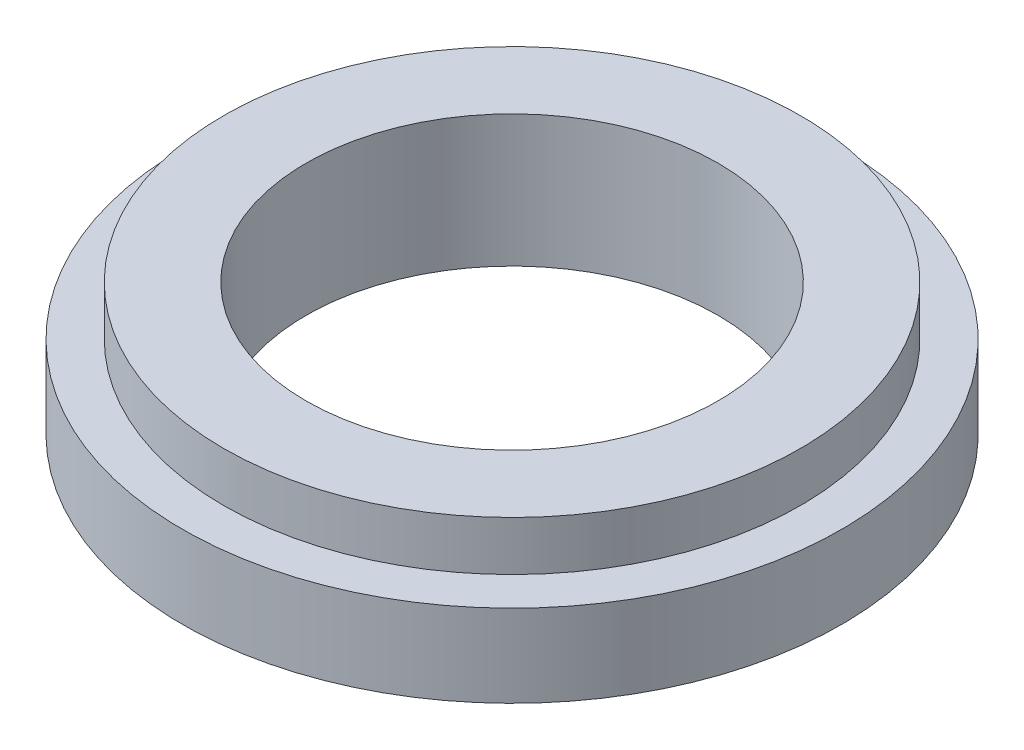
ISO-10303-21;
HEADER;
FILE_DESCRIPTION(('STEP AP214'),'2;1');
FILE_NAME('part.step','',(''),(''),'','','');
FILE_SCHEMA(('AUTOMOTIVE_DESIGN { 1 0 10303 214 1 1 1 1 }'));
ENDSEC;
DATA;
#1=APPLICATION_CONTEXT('core data for automotive mechanical design processes');
#2=APPLICATION_PROTOCOL_DEFINITION('international standard','automotive_design',2000,#1);
#3=PRODUCT_CONTEXT('',#1,'mechanical');
#4=PRODUCT('Part','Part','',(#3));
#5=PRODUCT_RELATED_PRODUCT_CATEGORY('part','',(#4));
#6=PRODUCT_DEFINITION_FORMATION('','',#4);
#7=PRODUCT_DEFINITION_CONTEXT('part definition',#1,'design');
#8=PRODUCT_DEFINITION('design','',#6,#7);
#9=PRODUCT_DEFINITION_SHAPE('','',#8);
#10=(LENGTH_UNIT() NAMED_UNIT(*) SI_UNIT(.MILLI.,.METRE.));
#11=(NAMED_UNIT(*) PLANE_ANGLE_UNIT() SI_UNIT($,.RADIAN.));
#12=(NAMED_UNIT(*) SI_UNIT($,.STERADIAN.) SOLID_ANGLE_UNIT());
#13=UNCERTAINTY_MEASURE_WITH_UNIT(LENGTH_MEASURE(1.E-05),#10,'distance_accuracy_value','');
#14=(GEOMETRIC_REPRESENTATION_CONTEXT(3) GLOBAL_UNCERTAINTY_ASSIGNED_CONTEXT((#13)) GLOBAL_UNIT_ASSIGNED_CONTEXT((#10,
#11,#12)) REPRESENTATION_CONTEXT('',''));
#15=CARTESIAN_POINT('',(0.,0.,0.));
#16=DIRECTION('',(0.,0.,1.));
#17=DIRECTION('',(1.,0.,0.));
#18=AXIS2_PLACEMENT_3D('',#15,#16,#17);
#19=CARTESIAN_POINT('',(0.,3.,0.));
#20=DIRECTION('',(0.,1.,0.));
#21=DIRECTION('',(0.,0.,1.));
#22=AXIS2_PLACEMENT_3D('',#19,#20,#21);
#23=PLANE('',#22);
#24=CARTESIAN_POINT('',(0.,3.,0.));
#25=DIRECTION('',(0.,1.,0.));
#26=DIRECTION('',(0.,0.,1.));
#27=AXIS2_PLACEMENT_3D('',#24,#25,#26);
#28=CIRCLE('',#27,17.5);
#29=CARTESIAN_POINT('',(0.,3.,17.5));
#30=VERTEX_POINT('',#29);
#31=EDGE_CURVE('E11',#30,#30,#28,.T.);
#32=ORIENTED_EDGE('',*,*,#31,.T.);
#33=EDGE_LOOP('',(#32));
#34=FACE_BOUND('',#33,.T.);
#35=CARTESIAN_POINT('',(0.,3.,0.));
#36=DIRECTION('',(0.,1.,0.));
#37=DIRECTION('',(0.,0.,1.));
#38=AXIS2_PLACEMENT_3D('',#35,#36,#37);
#39=CIRCLE('',#38,12.5);
#40=CARTESIAN_POINT('',(0.,3.,12.5));
#41=VERTEX_POINT('',#40);
#42=EDGE_CURVE('E45',#41,#41,#39,.T.);
#43=ORIENTED_EDGE('',*,*,#42,.F.);
#44=EDGE_LOOP('',(#43));
#45=FACE_BOUND('',#44,.T.);
#46=ADVANCED_FACE('F37',(#34,#45),#23,.T.);
#47=CARTESIAN_POINT('',(0.,3.,0.));
#48=DIRECTION('',(0.,-1.,0.));
#49=DIRECTION('',(0.,0.,-1.));
#50=AXIS2_PLACEMENT_3D('',#47,#48,#49);
#51=CYLINDRICAL_SURFACE('',#50,17.5);
#52=ORIENTED_EDGE('',*,*,#31,.F.);
#53=EDGE_LOOP('',(#52));
#54=FACE_BOUND('',#53,.T.);
#55=CARTESIAN_POINT('',(0.,0.,0.));
#56=DIRECTION('',(0.,1.,0.));
#57=DIRECTION('',(0.,0.,1.));
#58=AXIS2_PLACEMENT_3D('',#55,#56,#57);
#59=CIRCLE('',#58,17.5);
#60=CARTESIAN_POINT('',(0.,0.,17.5));
#61=VERTEX_POINT('',#60);
#62=EDGE_CURVE('E41',#61,#61,#59,.T.);
#63=ORIENTED_EDGE('',*,*,#62,.T.);
#64=EDGE_LOOP('',(#63));
#65=FACE_BOUND('',#64,.T.);
#66=ADVANCED_FACE('F39',(#54,#65),#51,.T.);
#67=CARTESIAN_POINT('',(0.,3.,0.));
#68=DIRECTION('',(0.,-1.,0.));
#69=DIRECTION('',(0.,0.,-1.));
#70=AXIS2_PLACEMENT_3D('',#67,#68,#69);
#71=CYLINDRICAL_SURFACE('',#70,12.5);
#72=ORIENTED_EDGE('',*,*,#42,.T.);
#73=EDGE_LOOP('',(#72));
#74=FACE_BOUND('',#73,.T.);
#75=CARTESIAN_POINT('',(0.,-5.,0.));
#76=DIRECTION('',(0.,-1.,0.));
#77=DIRECTION('',(0.,0.,-1.));
#78=AXIS2_PLACEMENT_3D('',#75,#76,#77);
#79=CIRCLE('',#78,12.5);
#80=CARTESIAN_POINT('',(0.,-5.,-12.5));
#81=VERTEX_POINT('',#80);
#82=EDGE_CURVE('E55',#81,#81,#79,.T.);
#83=ORIENTED_EDGE('',*,*,#82,.T.);
#84=EDGE_LOOP('',(#83));
#85=FACE_BOUND('',#84,.T.);
#86=ADVANCED_FACE('F61',(#74,#85),#71,.F.);
#87=CARTESIAN_POINT('',(0.,-5.,0.));
#88=DIRECTION('',(0.,-1.,0.));
#89=DIRECTION('',(0.,0.,-1.));
#90=AXIS2_PLACEMENT_3D('',#87,#88,#89);
#91=PLANE('',#90);
#92=CARTESIAN_POINT('',(0.,-5.,0.));
#93=DIRECTION('',(0.,-1.,0.));
#94=DIRECTION('',(0.,0.,-1.));
#95=AXIS2_PLACEMENT_3D('',#92,#93,#94);
#96=CIRCLE('',#95,20.);
#97=CARTESIAN_POINT('',(0.,-5.,-20.));
#98=VERTEX_POINT('',#97);
#99=EDGE_CURVE('E54',#98,#98,#96,.T.);
#100=ORIENTED_EDGE('',*,*,#99,.T.);
#101=EDGE_LOOP('',(#100));
#102=FACE_BOUND('',#101,.T.);
#103=ORIENTED_EDGE('',*,*,#82,.F.);
#104=EDGE_LOOP('',(#103));
#105=FACE_BOUND('',#104,.T.);
#106=ADVANCED_FACE('F63',(#102,#105),#91,.T.);
#107=CARTESIAN_POINT('',(0.,0.,0.));
#108=DIRECTION('',(0.,-1.,0.));
#109=DIRECTION('',(0.,0.,-1.));
#110=AXIS2_PLACEMENT_3D('',#107,#108,#109);
#111=PLANE('',#110);
#112=ORIENTED_EDGE('',*,*,#62,.F.);
#113=EDGE_LOOP('',(#112));
#114=FACE_BOUND('',#113,.T.);
#115=CARTESIAN_POINT('',(0.,0.,0.));
#116=DIRECTION('',(0.,-1.,0.));
#117=DIRECTION('',(0.,0.,-1.));
#118=AXIS2_PLACEMENT_3D('',#115,#116,#117);
#119=CIRCLE('',#118,20.);
#120=CARTESIAN_POINT('',(0.,0.,-20.));
#121=VERTEX_POINT('',#120);
#122=EDGE_CURVE('E51',#121,#121,#119,.T.);
#123=ORIENTED_EDGE('',*,*,#122,.F.);
#124=EDGE_LOOP('',(#123));
#125=FACE_BOUND('',#124,.T.);
#126=ADVANCED_FACE('F65',(#114,#125),#111,.F.);
#127=CARTESIAN_POINT('',(0.,-5.,0.));
#128=DIRECTION('',(0.,1.,0.));
#129=DIRECTION('',(0.,0.,1.));
#130=AXIS2_PLACEMENT_3D('',#127,#128,#129);
#131=CYLINDRICAL_SURFACE('',#130,20.);
#132=ORIENTED_EDGE('',*,*,#99,.F.);
#133=EDGE_LOOP('',(#132));
#134=FACE_BOUND('',#133,.T.);
#135=ORIENTED_EDGE('',*,*,#122,.T.);
#136=EDGE_LOOP('',(#135));
#137=FACE_BOUND('',#136,.T.);
#138=ADVANCED_FACE('F72',(#134,#137),#131,.T.);
#139=CLOSED_SHELL('',(#46,#66,#86,#106,#126,#138));
#140=MANIFOLD_SOLID_BREP('B2',#139);
#141=ADVANCED_BREP_SHAPE_REPRESENTATION('',(#18,#140),#14);
#142=SHAPE_DEFINITION_REPRESENTATION(#9,#141);
ENDSEC;
END-ISO-10303-21;
